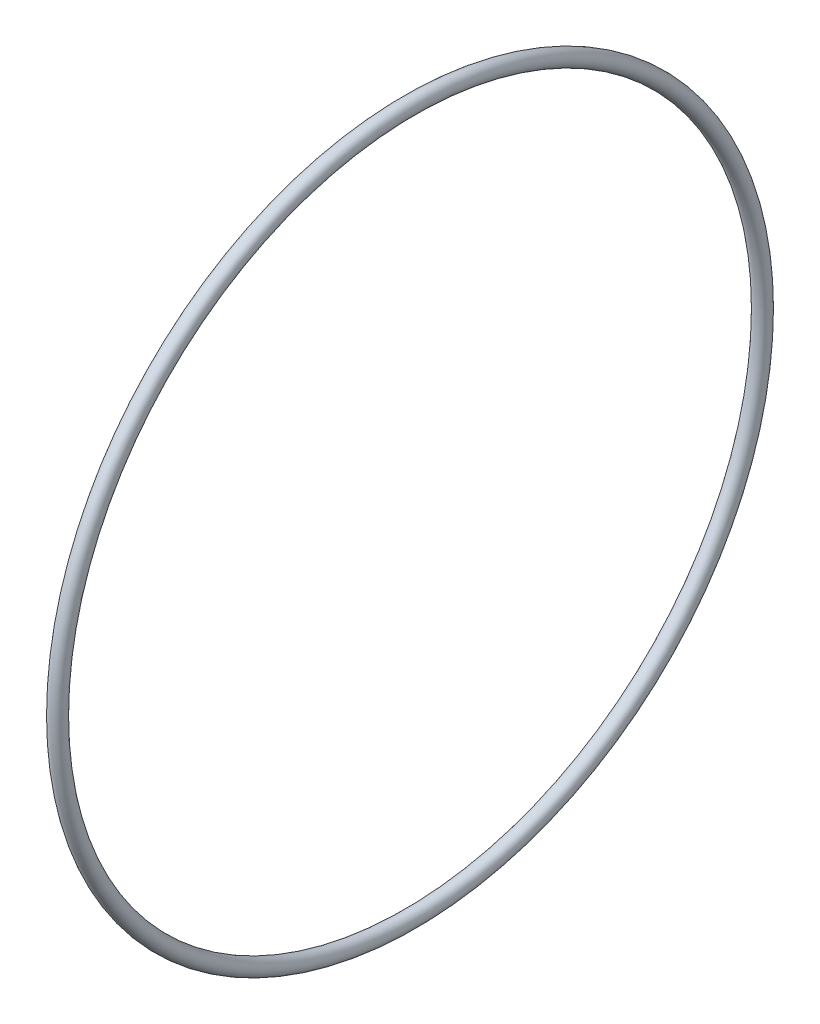
ISO-10303-21;
HEADER;
FILE_DESCRIPTION(('STEP AP214'),'2;1');
FILE_NAME('part.step','',(''),(''),'','','');
FILE_SCHEMA(('AUTOMOTIVE_DESIGN { 1 0 10303 214 1 1 1 1 }'));
ENDSEC;
DATA;
#1=APPLICATION_CONTEXT('core data for automotive mechanical design processes');
#2=APPLICATION_PROTOCOL_DEFINITION('international standard','automotive_design',2000,#1);
#3=PRODUCT_CONTEXT('',#1,'mechanical');
#4=PRODUCT('Part','Part','',(#3));
#5=PRODUCT_RELATED_PRODUCT_CATEGORY('part','',(#4));
#6=PRODUCT_DEFINITION_FORMATION('','',#4);
#7=PRODUCT_DEFINITION_CONTEXT('part definition',#1,'design');
#8=PRODUCT_DEFINITION('design','',#6,#7);
#9=PRODUCT_DEFINITION_SHAPE('','',#8);
#10=(LENGTH_UNIT() NAMED_UNIT(*) SI_UNIT(.MILLI.,.METRE.));
#11=(NAMED_UNIT(*) PLANE_ANGLE_UNIT() SI_UNIT($,.RADIAN.));
#12=(NAMED_UNIT(*) SI_UNIT($,.STERADIAN.) SOLID_ANGLE_UNIT());
#13=UNCERTAINTY_MEASURE_WITH_UNIT(LENGTH_MEASURE(1.E-05),#10,'distance_accuracy_value','');
#14=(GEOMETRIC_REPRESENTATION_CONTEXT(3) GLOBAL_UNCERTAINTY_ASSIGNED_CONTEXT((#13)) GLOBAL_UNIT_ASSIGNED_CONTEXT((#10,
#11,#12)) REPRESENTATION_CONTEXT('',''));
#15=CARTESIAN_POINT('',(0.,0.,0.));
#16=DIRECTION('',(0.,0.,1.));
#17=DIRECTION('',(1.,0.,0.));
#18=AXIS2_PLACEMENT_3D('',#15,#16,#17);
#19=CARTESIAN_POINT('',(0.,0.,0.));
#20=DIRECTION('',(-1.,0.,0.));
#21=DIRECTION('',(0.,0.,1.));
#22=AXIS2_PLACEMENT_3D('',#19,#20,#21);
#23=TOROIDAL_SURFACE('',#22,70.05,1.55);
#24=CARTESIAN_POINT('',(0.,0.,71.6));
#25=VERTEX_POINT('',#24);
#26=VERTEX_LOOP('',#25);
#27=FACE_BOUND('',#26,.T.);
#28=ADVANCED_FACE('F35',(#27),#23,.T.);
#29=CLOSED_SHELL('',(#28));
#30=MANIFOLD_SOLID_BREP('B2',#29);
#31=ADVANCED_BREP_SHAPE_REPRESENTATION('',(#18,#30),#14);
#32=SHAPE_DEFINITION_REPRESENTATION(#9,#31);
ENDSEC;
END-ISO-10303-21;
